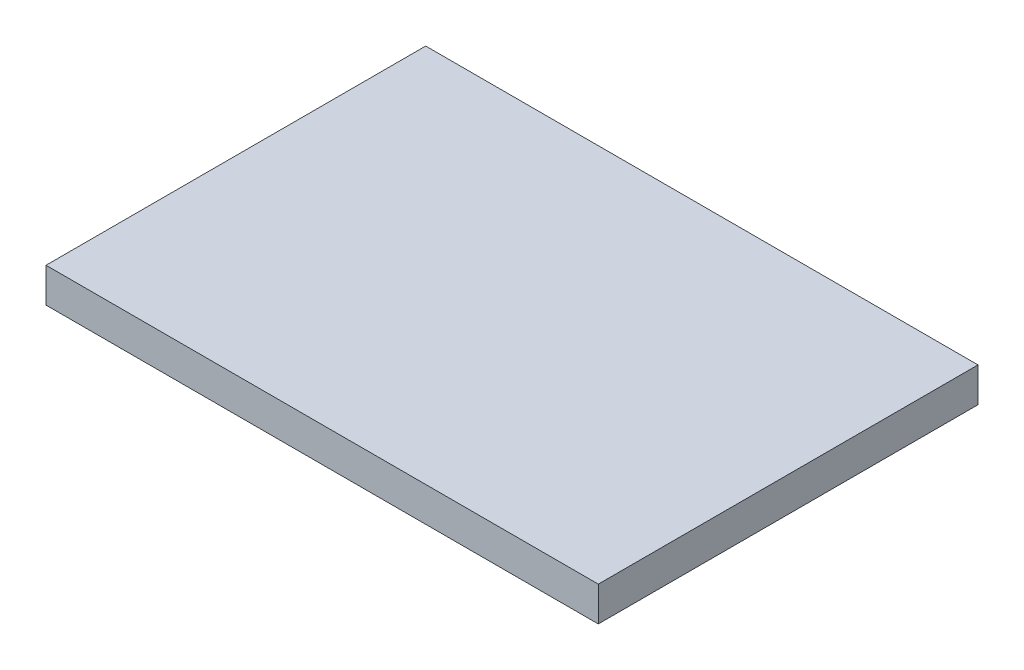
ISO-10303-21;
HEADER;
FILE_DESCRIPTION(('STEP AP214'),'2;1');
FILE_NAME('part.step','',(''),(''),'','','');
FILE_SCHEMA(('AUTOMOTIVE_DESIGN { 1 0 10303 214 1 1 1 1 }'));
ENDSEC;
DATA;
#1=APPLICATION_CONTEXT('core data for automotive mechanical design processes');
#2=APPLICATION_PROTOCOL_DEFINITION('international standard','automotive_design',2000,#1);
#3=PRODUCT_CONTEXT('',#1,'mechanical');
#4=PRODUCT('Part','Part','',(#3));
#5=PRODUCT_RELATED_PRODUCT_CATEGORY('part','',(#4));
#6=PRODUCT_DEFINITION_FORMATION('','',#4);
#7=PRODUCT_DEFINITION_CONTEXT('part definition',#1,'design');
#8=PRODUCT_DEFINITION('design','',#6,#7);
#9=PRODUCT_DEFINITION_SHAPE('','',#8);
#10=(LENGTH_UNIT() NAMED_UNIT(*) SI_UNIT(.MILLI.,.METRE.));
#11=(NAMED_UNIT(*) PLANE_ANGLE_UNIT() SI_UNIT($,.RADIAN.));
#12=(NAMED_UNIT(*) SI_UNIT($,.STERADIAN.) SOLID_ANGLE_UNIT());
#13=UNCERTAINTY_MEASURE_WITH_UNIT(LENGTH_MEASURE(1.E-05),#10,'distance_accuracy_value','');
#14=(GEOMETRIC_REPRESENTATION_CONTEXT(3) GLOBAL_UNCERTAINTY_ASSIGNED_CONTEXT((#13)) GLOBAL_UNIT_ASSIGNED_CONTEXT((#10,
#11,#12)) REPRESENTATION_CONTEXT('',''));
#15=CARTESIAN_POINT('',(0.,0.,0.));
#16=DIRECTION('',(0.,0.,1.));
#17=DIRECTION('',(1.,0.,0.));
#18=AXIS2_PLACEMENT_3D('',#15,#16,#17);
#19=CARTESIAN_POINT('',(-16.,2.,11.));
#20=DIRECTION('',(1.,0.,0.));
#21=DIRECTION('',(0.,0.,-1.));
#22=AXIS2_PLACEMENT_3D('',#19,#20,#21);
#23=PLANE('',#22);
#24=DIRECTION('',(0.,0.,1.));
#25=VECTOR('',#24,1.);
#26=CARTESIAN_POINT('',(-16.,0.,11.));
#27=LINE('',#26,#25);
#28=CARTESIAN_POINT('',(-16.,0.,-11.));
#29=VERTEX_POINT('',#28);
#30=CARTESIAN_POINT('',(-16.,0.,11.));
#31=VERTEX_POINT('',#30);
#32=EDGE_CURVE('E95',#29,#31,#27,.T.);
#33=ORIENTED_EDGE('',*,*,#32,.T.);
#34=DIRECTION('',(0.,-1.,0.));
#35=VECTOR('',#34,1.);
#36=CARTESIAN_POINT('',(-16.,2.,11.));
#37=LINE('',#36,#35);
#38=CARTESIAN_POINT('',(-16.,2.,11.));
#39=VERTEX_POINT('',#38);
#40=EDGE_CURVE('E11',#39,#31,#37,.T.);
#41=ORIENTED_EDGE('',*,*,#40,.F.);
#42=DIRECTION('',(0.,0.,1.));
#43=VECTOR('',#42,1.);
#44=CARTESIAN_POINT('',(-16.,2.,11.));
#45=LINE('',#44,#43);
#46=CARTESIAN_POINT('',(-16.,2.,-11.));
#47=VERTEX_POINT('',#46);
#48=EDGE_CURVE('E83',#47,#39,#45,.T.);
#49=ORIENTED_EDGE('',*,*,#48,.F.);
#50=DIRECTION('',(0.,-1.,0.));
#51=VECTOR('',#50,1.);
#52=CARTESIAN_POINT('',(-16.,2.,-11.));
#53=LINE('',#52,#51);
#54=EDGE_CURVE('E91',#47,#29,#53,.T.);
#55=ORIENTED_EDGE('',*,*,#54,.T.);
#56=EDGE_LOOP('',(#33,#41,#49,#55));
#57=FACE_BOUND('',#56,.T.);
#58=ADVANCED_FACE('F32',(#57),#23,.F.);
#59=CARTESIAN_POINT('',(16.,2.,11.));
#60=DIRECTION('',(0.,0.,-1.));
#61=DIRECTION('',(-1.,0.,0.));
#62=AXIS2_PLACEMENT_3D('',#59,#60,#61);
#63=PLANE('',#62);
#64=DIRECTION('',(1.,0.,0.));
#65=VECTOR('',#64,1.);
#66=CARTESIAN_POINT('',(16.,0.,11.));
#67=LINE('',#66,#65);
#68=CARTESIAN_POINT('',(16.,0.,11.));
#69=VERTEX_POINT('',#68);
#70=EDGE_CURVE('E87',#31,#69,#67,.T.);
#71=ORIENTED_EDGE('',*,*,#70,.T.);
#72=DIRECTION('',(0.,-1.,0.));
#73=VECTOR('',#72,1.);
#74=CARTESIAN_POINT('',(16.,2.,11.));
#75=LINE('',#74,#73);
#76=CARTESIAN_POINT('',(16.,2.,11.));
#77=VERTEX_POINT('',#76);
#78=EDGE_CURVE('E40',#77,#69,#75,.T.);
#79=ORIENTED_EDGE('',*,*,#78,.F.);
#80=DIRECTION('',(1.,0.,0.));
#81=VECTOR('',#80,1.);
#82=CARTESIAN_POINT('',(16.,2.,11.));
#83=LINE('',#82,#81);
#84=EDGE_CURVE('E78',#39,#77,#83,.T.);
#85=ORIENTED_EDGE('',*,*,#84,.F.);
#86=ORIENTED_EDGE('',*,*,#40,.T.);
#87=EDGE_LOOP('',(#71,#79,#85,#86));
#88=FACE_BOUND('',#87,.T.);
#89=ADVANCED_FACE('F86',(#88),#63,.F.);
#90=CARTESIAN_POINT('',(16.,2.,11.));
#91=DIRECTION('',(-1.,0.,0.));
#92=DIRECTION('',(0.,0.,1.));
#93=AXIS2_PLACEMENT_3D('',#90,#91,#92);
#94=PLANE('',#93);
#95=DIRECTION('',(0.,0.,-1.));
#96=VECTOR('',#95,1.);
#97=CARTESIAN_POINT('',(16.,0.,11.));
#98=LINE('',#97,#96);
#99=CARTESIAN_POINT('',(16.,0.,-11.));
#100=VERTEX_POINT('',#99);
#101=EDGE_CURVE('E65',#69,#100,#98,.T.);
#102=ORIENTED_EDGE('',*,*,#101,.T.);
#103=DIRECTION('',(0.,-1.,0.));
#104=VECTOR('',#103,1.);
#105=CARTESIAN_POINT('',(16.,2.,-11.));
#106=LINE('',#105,#104);
#107=CARTESIAN_POINT('',(16.,2.,-11.));
#108=VERTEX_POINT('',#107);
#109=EDGE_CURVE('E88',#108,#100,#106,.T.);
#110=ORIENTED_EDGE('',*,*,#109,.F.);
#111=DIRECTION('',(0.,0.,-1.));
#112=VECTOR('',#111,1.);
#113=CARTESIAN_POINT('',(16.,2.,11.));
#114=LINE('',#113,#112);
#115=EDGE_CURVE('E81',#77,#108,#114,.T.);
#116=ORIENTED_EDGE('',*,*,#115,.F.);
#117=ORIENTED_EDGE('',*,*,#78,.T.);
#118=EDGE_LOOP('',(#102,#110,#116,#117));
#119=FACE_BOUND('',#118,.T.);
#120=ADVANCED_FACE('F89',(#119),#94,.F.);
#121=CARTESIAN_POINT('',(16.,2.,-11.));
#122=DIRECTION('',(0.,0.,1.));
#123=DIRECTION('',(1.,0.,0.));
#124=AXIS2_PLACEMENT_3D('',#121,#122,#123);
#125=PLANE('',#124);
#126=DIRECTION('',(-1.,0.,0.));
#127=VECTOR('',#126,1.);
#128=CARTESIAN_POINT('',(16.,0.,-11.));
#129=LINE('',#128,#127);
#130=EDGE_CURVE('E71',#100,#29,#129,.T.);
#131=ORIENTED_EDGE('',*,*,#130,.T.);
#132=ORIENTED_EDGE('',*,*,#54,.F.);
#133=DIRECTION('',(-1.,0.,0.));
#134=VECTOR('',#133,1.);
#135=CARTESIAN_POINT('',(16.,2.,-11.));
#136=LINE('',#135,#134);
#137=EDGE_CURVE('E48',#108,#47,#136,.T.);
#138=ORIENTED_EDGE('',*,*,#137,.F.);
#139=ORIENTED_EDGE('',*,*,#109,.T.);
#140=EDGE_LOOP('',(#131,#132,#138,#139));
#141=FACE_BOUND('',#140,.T.);
#142=ADVANCED_FACE('F102',(#141),#125,.F.);
#143=CARTESIAN_POINT('',(0.,2.,0.));
#144=DIRECTION('',(0.,1.,0.));
#145=DIRECTION('',(0.,0.,1.));
#146=AXIS2_PLACEMENT_3D('',#143,#144,#145);
#147=PLANE('',#146);
#148=ORIENTED_EDGE('',*,*,#48,.T.);
#149=ORIENTED_EDGE('',*,*,#84,.T.);
#150=ORIENTED_EDGE('',*,*,#115,.T.);
#151=ORIENTED_EDGE('',*,*,#137,.T.);
#152=EDGE_LOOP('',(#148,#149,#150,#151));
#153=FACE_BOUND('',#152,.T.);
#154=ADVANCED_FACE('F79',(#153),#147,.T.);
#155=CARTESIAN_POINT('',(0.,0.,0.));
#156=DIRECTION('',(0.,1.,0.));
#157=DIRECTION('',(0.,0.,1.));
#158=AXIS2_PLACEMENT_3D('',#155,#156,#157);
#159=PLANE('',#158);
#160=ORIENTED_EDGE('',*,*,#32,.F.);
#161=ORIENTED_EDGE('',*,*,#130,.F.);
#162=ORIENTED_EDGE('',*,*,#101,.F.);
#163=ORIENTED_EDGE('',*,*,#70,.F.);
#164=EDGE_LOOP('',(#160,#161,#162,#163));
#165=FACE_BOUND('',#164,.T.);
#166=ADVANCED_FACE('F105',(#165),#159,.F.);
#167=CLOSED_SHELL('',(#58,#89,#120,#142,#154,#166));
#168=MANIFOLD_SOLID_BREP('B2',#167);
#169=ADVANCED_BREP_SHAPE_REPRESENTATION('',(#18,#168),#14);
#170=SHAPE_DEFINITION_REPRESENTATION(#9,#169);
ENDSEC;
END-ISO-10303-21;
